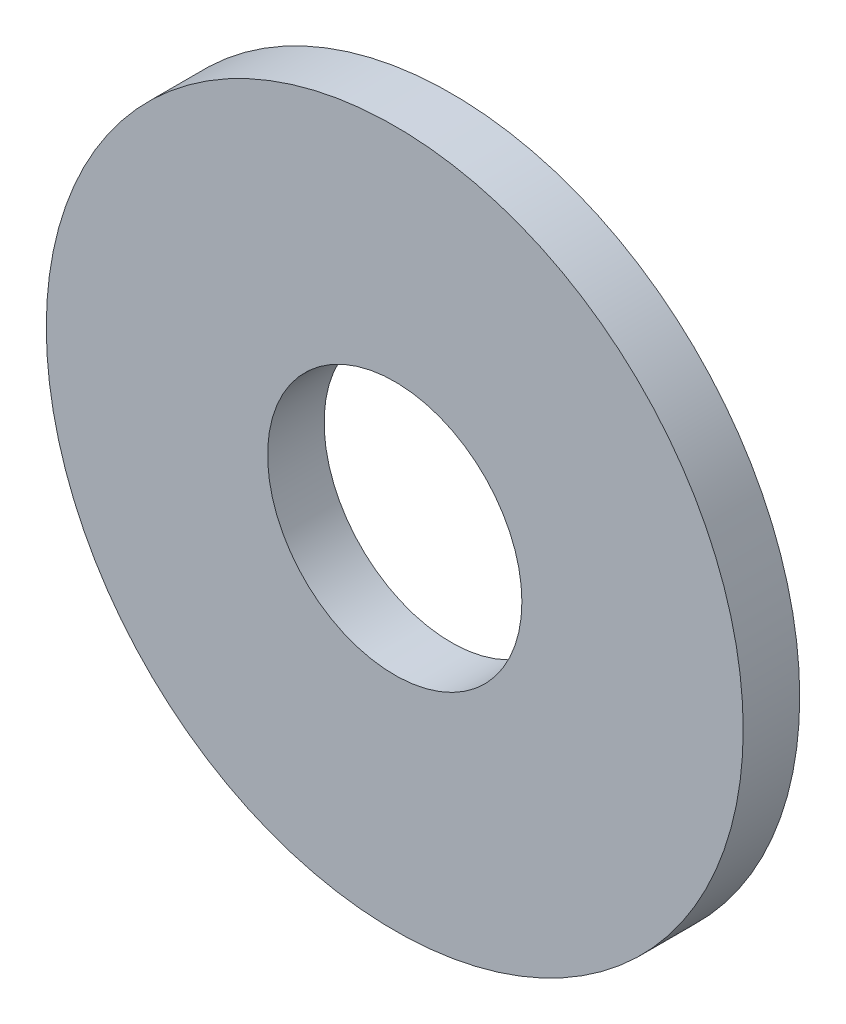
ISO-10303-21;
HEADER;
FILE_DESCRIPTION(('STEP AP214'),'2;1');
FILE_NAME('part.step','',(''),(''),'','','');
FILE_SCHEMA(('AUTOMOTIVE_DESIGN { 1 0 10303 214 1 1 1 1 }'));
ENDSEC;
DATA;
#1=APPLICATION_CONTEXT('core data for automotive mechanical design processes');
#2=APPLICATION_PROTOCOL_DEFINITION('international standard','automotive_design',2000,#1);
#3=PRODUCT_CONTEXT('',#1,'mechanical');
#4=PRODUCT('Part','Part','',(#3));
#5=PRODUCT_RELATED_PRODUCT_CATEGORY('part','',(#4));
#6=PRODUCT_DEFINITION_FORMATION('','',#4);
#7=PRODUCT_DEFINITION_CONTEXT('part definition',#1,'design');
#8=PRODUCT_DEFINITION('design','',#6,#7);
#9=PRODUCT_DEFINITION_SHAPE('','',#8);
#10=(LENGTH_UNIT() NAMED_UNIT(*) SI_UNIT(.MILLI.,.METRE.));
#11=(NAMED_UNIT(*) PLANE_ANGLE_UNIT() SI_UNIT($,.RADIAN.));
#12=(NAMED_UNIT(*) SI_UNIT($,.STERADIAN.) SOLID_ANGLE_UNIT());
#13=UNCERTAINTY_MEASURE_WITH_UNIT(LENGTH_MEASURE(1.E-05),#10,'distance_accuracy_value','');
#14=(GEOMETRIC_REPRESENTATION_CONTEXT(3) GLOBAL_UNCERTAINTY_ASSIGNED_CONTEXT((#13)) GLOBAL_UNIT_ASSIGNED_CONTEXT((#10,
#11,#12)) REPRESENTATION_CONTEXT('',''));
#15=CARTESIAN_POINT('',(0.,0.,0.));
#16=DIRECTION('',(0.,0.,1.));
#17=DIRECTION('',(1.,0.,0.));
#18=AXIS2_PLACEMENT_3D('',#15,#16,#17);
#19=CARTESIAN_POINT('',(0.,0.,0.6));
#20=DIRECTION('',(0.,0.,1.));
#21=DIRECTION('',(1.,0.,0.));
#22=AXIS2_PLACEMENT_3D('',#19,#20,#21);
#23=PLANE('',#22);
#24=CARTESIAN_POINT('',(0.,0.,0.6));
#25=DIRECTION('',(0.,0.,1.));
#26=DIRECTION('',(1.,0.,0.));
#27=AXIS2_PLACEMENT_3D('',#24,#25,#26);
#28=CIRCLE('',#27,7.4);
#29=CARTESIAN_POINT('',(7.4,0.,0.6));
#30=VERTEX_POINT('',#29);
#31=EDGE_CURVE('E10',#30,#30,#28,.T.);
#32=ORIENTED_EDGE('',*,*,#31,.T.);
#33=EDGE_LOOP('',(#32));
#34=FACE_BOUND('',#33,.T.);
#35=CARTESIAN_POINT('',(0.,0.,0.6));
#36=DIRECTION('',(0.,0.,1.));
#37=DIRECTION('',(1.,0.,0.));
#38=AXIS2_PLACEMENT_3D('',#35,#36,#37);
#39=CIRCLE('',#38,2.7);
#40=CARTESIAN_POINT('',(2.7,0.,0.6));
#41=VERTEX_POINT('',#40);
#42=EDGE_CURVE('E41',#41,#41,#39,.T.);
#43=ORIENTED_EDGE('',*,*,#42,.F.);
#44=EDGE_LOOP('',(#43));
#45=FACE_BOUND('',#44,.T.);
#46=ADVANCED_FACE('F30',(#34,#45),#23,.T.);
#47=CARTESIAN_POINT('',(0.,0.,-0.6));
#48=DIRECTION('',(0.,0.,1.));
#49=DIRECTION('',(1.,0.,0.));
#50=AXIS2_PLACEMENT_3D('',#47,#48,#49);
#51=PLANE('',#50);
#52=CARTESIAN_POINT('',(0.,0.,-0.6));
#53=DIRECTION('',(0.,0.,1.));
#54=DIRECTION('',(1.,0.,0.));
#55=AXIS2_PLACEMENT_3D('',#52,#53,#54);
#56=CIRCLE('',#55,7.4);
#57=CARTESIAN_POINT('',(7.4,0.,-0.6));
#58=VERTEX_POINT('',#57);
#59=EDGE_CURVE('E34',#58,#58,#56,.T.);
#60=ORIENTED_EDGE('',*,*,#59,.F.);
#61=EDGE_LOOP('',(#60));
#62=FACE_BOUND('',#61,.T.);
#63=CARTESIAN_POINT('',(0.,0.,-0.6));
#64=DIRECTION('',(0.,0.,1.));
#65=DIRECTION('',(1.,0.,0.));
#66=AXIS2_PLACEMENT_3D('',#63,#64,#65);
#67=CIRCLE('',#66,2.7);
#68=CARTESIAN_POINT('',(2.7,0.,-0.6));
#69=VERTEX_POINT('',#68);
#70=EDGE_CURVE('E43',#69,#69,#67,.T.);
#71=ORIENTED_EDGE('',*,*,#70,.T.);
#72=EDGE_LOOP('',(#71));
#73=FACE_BOUND('',#72,.T.);
#74=ADVANCED_FACE('F53',(#62,#73),#51,.F.);
#75=CARTESIAN_POINT('',(0.,0.,0.6));
#76=DIRECTION('',(0.,0.,-1.));
#77=DIRECTION('',(-1.,0.,0.));
#78=AXIS2_PLACEMENT_3D('',#75,#76,#77);
#79=CYLINDRICAL_SURFACE('',#78,7.4);
#80=ORIENTED_EDGE('',*,*,#31,.F.);
#81=EDGE_LOOP('',(#80));
#82=FACE_BOUND('',#81,.T.);
#83=ORIENTED_EDGE('',*,*,#59,.T.);
#84=EDGE_LOOP('',(#83));
#85=FACE_BOUND('',#84,.T.);
#86=ADVANCED_FACE('F32',(#82,#85),#79,.T.);
#87=CARTESIAN_POINT('',(0.,0.,0.6));
#88=DIRECTION('',(0.,0.,-1.));
#89=DIRECTION('',(-1.,0.,0.));
#90=AXIS2_PLACEMENT_3D('',#87,#88,#89);
#91=CYLINDRICAL_SURFACE('',#90,2.7);
#92=ORIENTED_EDGE('',*,*,#42,.T.);
#93=EDGE_LOOP('',(#92));
#94=FACE_BOUND('',#93,.T.);
#95=ORIENTED_EDGE('',*,*,#70,.F.);
#96=EDGE_LOOP('',(#95));
#97=FACE_BOUND('',#96,.T.);
#98=ADVANCED_FACE('F49',(#94,#97),#91,.F.);
#99=CLOSED_SHELL('',(#46,#74,#86,#98));
#100=MANIFOLD_SOLID_BREP('B2',#99);
#101=ADVANCED_BREP_SHAPE_REPRESENTATION('',(#18,#100),#14);
#102=SHAPE_DEFINITION_REPRESENTATION(#9,#101);
ENDSEC;
END-ISO-10303-21;
